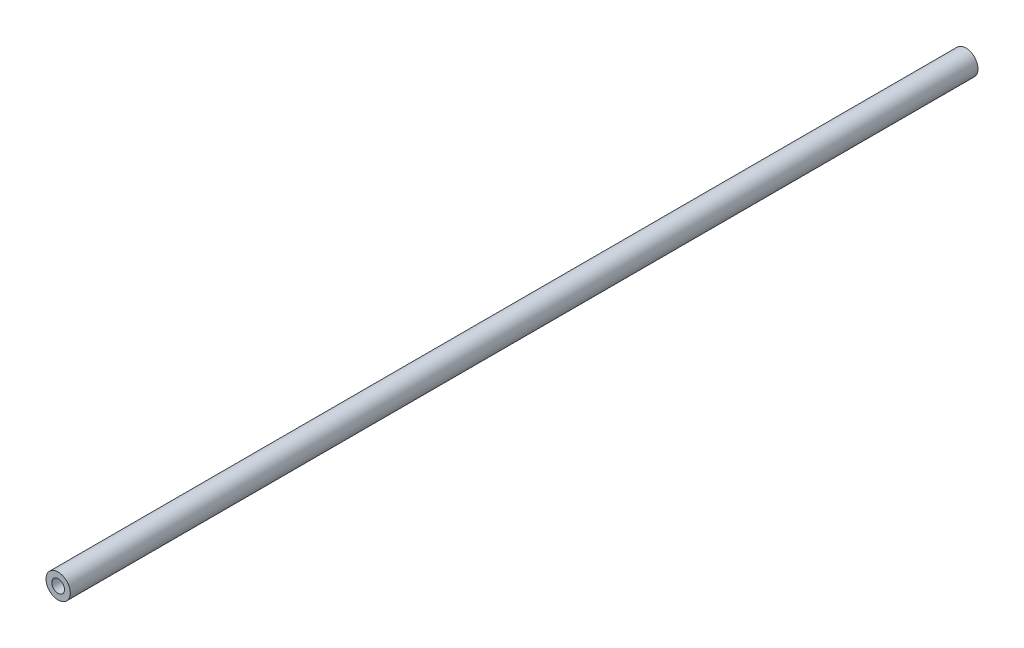
ISO-10303-21;
HEADER;
FILE_DESCRIPTION(('STEP AP214'),'2;1');
FILE_NAME('part.step','',(''),(''),'','','');
FILE_SCHEMA(('AUTOMOTIVE_DESIGN { 1 0 10303 214 1 1 1 1 }'));
ENDSEC;
DATA;
#1=APPLICATION_CONTEXT('core data for automotive mechanical design processes');
#2=APPLICATION_PROTOCOL_DEFINITION('international standard','automotive_design',2000,#1);
#3=PRODUCT_CONTEXT('',#1,'mechanical');
#4=PRODUCT('Part','Part','',(#3));
#5=PRODUCT_RELATED_PRODUCT_CATEGORY('part','',(#4));
#6=PRODUCT_DEFINITION_FORMATION('','',#4);
#7=PRODUCT_DEFINITION_CONTEXT('part definition',#1,'design');
#8=PRODUCT_DEFINITION('design','',#6,#7);
#9=PRODUCT_DEFINITION_SHAPE('','',#8);
#10=(LENGTH_UNIT() NAMED_UNIT(*) SI_UNIT(.MILLI.,.METRE.));
#11=(NAMED_UNIT(*) PLANE_ANGLE_UNIT() SI_UNIT($,.RADIAN.));
#12=(NAMED_UNIT(*) SI_UNIT($,.STERADIAN.) SOLID_ANGLE_UNIT());
#13=UNCERTAINTY_MEASURE_WITH_UNIT(LENGTH_MEASURE(1.E-05),#10,'distance_accuracy_value','');
#14=(GEOMETRIC_REPRESENTATION_CONTEXT(3) GLOBAL_UNCERTAINTY_ASSIGNED_CONTEXT((#13)) GLOBAL_UNIT_ASSIGNED_CONTEXT((#10,
#11,#12)) REPRESENTATION_CONTEXT('',''));
#15=CARTESIAN_POINT('',(0.,0.,0.));
#16=DIRECTION('',(0.,0.,1.));
#17=DIRECTION('',(1.,0.,0.));
#18=AXIS2_PLACEMENT_3D('',#15,#16,#17);
#19=CARTESIAN_POINT('',(0.,0.,177.8));
#20=DIRECTION('',(0.,0.,1.));
#21=DIRECTION('',(1.,0.,0.));
#22=AXIS2_PLACEMENT_3D('',#19,#20,#21);
#23=PLANE('',#22);
#24=CARTESIAN_POINT('',(0.,0.,177.8));
#25=DIRECTION('',(0.,0.,1.));
#26=DIRECTION('',(1.,0.,0.));
#27=AXIS2_PLACEMENT_3D('',#24,#25,#26);
#28=CIRCLE('',#27,4.7625);
#29=CARTESIAN_POINT('',(4.7625,0.,177.8));
#30=VERTEX_POINT('',#29);
#31=EDGE_CURVE('E10',#30,#30,#28,.T.);
#32=ORIENTED_EDGE('',*,*,#31,.T.);
#33=EDGE_LOOP('',(#32));
#34=FACE_BOUND('',#33,.T.);
#35=CARTESIAN_POINT('',(0.,0.,177.8));
#36=DIRECTION('',(0.,0.,1.));
#37=DIRECTION('',(1.,0.,0.));
#38=AXIS2_PLACEMENT_3D('',#35,#36,#37);
#39=CIRCLE('',#38,2.4892);
#40=CARTESIAN_POINT('',(2.4892,0.,177.8));
#41=VERTEX_POINT('',#40);
#42=EDGE_CURVE('E56',#41,#41,#39,.T.);
#43=ORIENTED_EDGE('',*,*,#42,.F.);
#44=EDGE_LOOP('',(#43));
#45=FACE_BOUND('',#44,.T.);
#46=ADVANCED_FACE('F43',(#34,#45),#23,.T.);
#47=CARTESIAN_POINT('',(0.,0.,-177.8));
#48=DIRECTION('',(0.,0.,1.));
#49=DIRECTION('',(1.,0.,0.));
#50=AXIS2_PLACEMENT_3D('',#47,#48,#49);
#51=PLANE('',#50);
#52=CARTESIAN_POINT('',(0.,0.,-177.8));
#53=DIRECTION('',(0.,0.,1.));
#54=DIRECTION('',(1.,0.,0.));
#55=AXIS2_PLACEMENT_3D('',#52,#53,#54);
#56=CIRCLE('',#55,4.7625);
#57=CARTESIAN_POINT('',(4.7625,0.,-177.8));
#58=VERTEX_POINT('',#57);
#59=EDGE_CURVE('E47',#58,#58,#56,.T.);
#60=ORIENTED_EDGE('',*,*,#59,.F.);
#61=EDGE_LOOP('',(#60));
#62=FACE_BOUND('',#61,.T.);
#63=CARTESIAN_POINT('',(0.,0.,-177.8));
#64=DIRECTION('',(0.,0.,1.));
#65=DIRECTION('',(1.,0.,0.));
#66=AXIS2_PLACEMENT_3D('',#63,#64,#65);
#67=CIRCLE('',#66,2.4892);
#68=CARTESIAN_POINT('',(2.4892,0.,-177.8));
#69=VERTEX_POINT('',#68);
#70=EDGE_CURVE('E58',#69,#69,#67,.T.);
#71=ORIENTED_EDGE('',*,*,#70,.T.);
#72=EDGE_LOOP('',(#71));
#73=FACE_BOUND('',#72,.T.);
#74=ADVANCED_FACE('F70',(#62,#73),#51,.F.);
#75=CARTESIAN_POINT('',(0.,0.,177.8));
#76=DIRECTION('',(0.,0.,-1.));
#77=DIRECTION('',(-1.,0.,0.));
#78=AXIS2_PLACEMENT_3D('',#75,#76,#77);
#79=CYLINDRICAL_SURFACE('',#78,4.7625);
#80=ORIENTED_EDGE('',*,*,#31,.F.);
#81=EDGE_LOOP('',(#80));
#82=FACE_BOUND('',#81,.T.);
#83=ORIENTED_EDGE('',*,*,#59,.T.);
#84=EDGE_LOOP('',(#83));
#85=FACE_BOUND('',#84,.T.);
#86=ADVANCED_FACE('F45',(#82,#85),#79,.T.);
#87=CARTESIAN_POINT('',(0.,0.,177.8));
#88=DIRECTION('',(0.,0.,-1.));
#89=DIRECTION('',(-1.,0.,0.));
#90=AXIS2_PLACEMENT_3D('',#87,#88,#89);
#91=CYLINDRICAL_SURFACE('',#90,2.4892);
#92=ORIENTED_EDGE('',*,*,#42,.T.);
#93=EDGE_LOOP('',(#92));
#94=FACE_BOUND('',#93,.T.);
#95=ORIENTED_EDGE('',*,*,#70,.F.);
#96=EDGE_LOOP('',(#95));
#97=FACE_BOUND('',#96,.T.);
#98=ADVANCED_FACE('F66',(#94,#97),#91,.F.);
#99=CLOSED_SHELL('',(#46,#74,#86,#98));
#100=MANIFOLD_SOLID_BREP('B2',#99);
#101=ADVANCED_BREP_SHAPE_REPRESENTATION('',(#18,#100),#14);
#102=SHAPE_DEFINITION_REPRESENTATION(#9,#101);
ENDSEC;
END-ISO-10303-21;
